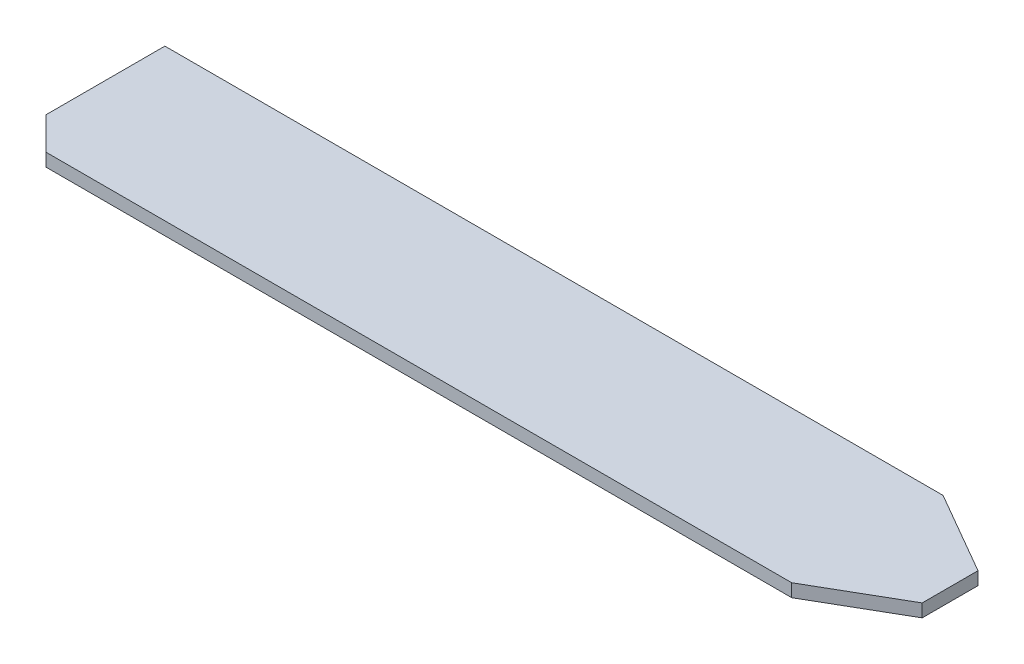
ISO-10303-21;
HEADER;
FILE_DESCRIPTION(('STEP AP214'),'2;1');
FILE_NAME('part.step','',(''),(''),'','','');
FILE_SCHEMA(('AUTOMOTIVE_DESIGN { 1 0 10303 214 1 1 1 1 }'));
ENDSEC;
DATA;
#1=APPLICATION_CONTEXT('core data for automotive mechanical design processes');
#2=APPLICATION_PROTOCOL_DEFINITION('international standard','automotive_design',2000,#1);
#3=PRODUCT_CONTEXT('',#1,'mechanical');
#4=PRODUCT('Part','Part','',(#3));
#5=PRODUCT_RELATED_PRODUCT_CATEGORY('part','',(#4));
#6=PRODUCT_DEFINITION_FORMATION('','',#4);
#7=PRODUCT_DEFINITION_CONTEXT('part definition',#1,'design');
#8=PRODUCT_DEFINITION('design','',#6,#7);
#9=PRODUCT_DEFINITION_SHAPE('','',#8);
#10=(LENGTH_UNIT() NAMED_UNIT(*) SI_UNIT(.MILLI.,.METRE.));
#11=(NAMED_UNIT(*) PLANE_ANGLE_UNIT() SI_UNIT($,.RADIAN.));
#12=(NAMED_UNIT(*) SI_UNIT($,.STERADIAN.) SOLID_ANGLE_UNIT());
#13=UNCERTAINTY_MEASURE_WITH_UNIT(LENGTH_MEASURE(1.E-05),#10,'distance_accuracy_value','');
#14=(GEOMETRIC_REPRESENTATION_CONTEXT(3) GLOBAL_UNCERTAINTY_ASSIGNED_CONTEXT((#13)) GLOBAL_UNIT_ASSIGNED_CONTEXT((#10,
#11,#12)) REPRESENTATION_CONTEXT('',''));
#15=CARTESIAN_POINT('',(0.,0.,0.));
#16=DIRECTION('',(0.,0.,1.));
#17=DIRECTION('',(1.,0.,0.));
#18=AXIS2_PLACEMENT_3D('',#15,#16,#17);
#19=CARTESIAN_POINT('',(360.,6.,0.));
#20=DIRECTION('',(0.500000000000001,0.,-0.866025403784438));
#21=DIRECTION('',(-0.866025403784438,0.,-0.500000000000001));
#22=AXIS2_PLACEMENT_3D('',#19,#20,#21);
#23=PLANE('',#22);
#24=DIRECTION('',(0.866025403784438,0.,0.500000000000001));
#25=VECTOR('',#24,1.);
#26=CARTESIAN_POINT('',(360.,0.,0.));
#27=LINE('',#26,#25);
#28=CARTESIAN_POINT('',(360.,0.,0.));
#29=VERTEX_POINT('',#28);
#30=CARTESIAN_POINT('',(398.261815458281,0.,22.0904694545226));
#31=VERTEX_POINT('',#30);
#32=EDGE_CURVE('E136',#29,#31,#27,.T.);
#33=ORIENTED_EDGE('',*,*,#32,.F.);
#34=DIRECTION('',(0.,-1.,0.));
#35=VECTOR('',#34,1.);
#36=CARTESIAN_POINT('',(360.,6.,0.));
#37=LINE('',#36,#35);
#38=CARTESIAN_POINT('',(360.,6.,0.));
#39=VERTEX_POINT('',#38);
#40=EDGE_CURVE('E11',#39,#29,#37,.T.);
#41=ORIENTED_EDGE('',*,*,#40,.F.);
#42=DIRECTION('',(0.866025403784438,0.,0.500000000000001));
#43=VECTOR('',#42,1.);
#44=CARTESIAN_POINT('',(360.,6.,0.));
#45=LINE('',#44,#43);
#46=CARTESIAN_POINT('',(398.261815458281,6.,22.0904694545226));
#47=VERTEX_POINT('',#46);
#48=EDGE_CURVE('E153',#39,#47,#45,.T.);
#49=ORIENTED_EDGE('',*,*,#48,.T.);
#50=DIRECTION('',(0.,-1.,0.));
#51=VECTOR('',#50,1.);
#52=CARTESIAN_POINT('',(398.261815458281,6.,22.0904694545226));
#53=LINE('',#52,#51);
#54=EDGE_CURVE('E48',#47,#31,#53,.T.);
#55=ORIENTED_EDGE('',*,*,#54,.T.);
#56=EDGE_LOOP('',(#33,#41,#49,#55));
#57=FACE_BOUND('',#56,.T.);
#58=ADVANCED_FACE('F45',(#57),#23,.T.);
#59=CARTESIAN_POINT('',(0.,6.,0.));
#60=DIRECTION('',(0.,0.,-1.));
#61=DIRECTION('',(-1.,0.,0.));
#62=AXIS2_PLACEMENT_3D('',#59,#60,#61);
#63=PLANE('',#62);
#64=DIRECTION('',(1.,0.,0.));
#65=VECTOR('',#64,1.);
#66=CARTESIAN_POINT('',(0.,0.,0.));
#67=LINE('',#66,#65);
#68=CARTESIAN_POINT('',(0.,0.,0.));
#69=VERTEX_POINT('',#68);
#70=EDGE_CURVE('E151',#69,#29,#67,.T.);
#71=ORIENTED_EDGE('',*,*,#70,.F.);
#72=DIRECTION('',(0.,-1.,0.));
#73=VECTOR('',#72,1.);
#74=CARTESIAN_POINT('',(0.,6.,0.));
#75=LINE('',#74,#73);
#76=CARTESIAN_POINT('',(0.,6.,0.));
#77=VERTEX_POINT('',#76);
#78=EDGE_CURVE('E54',#77,#69,#75,.T.);
#79=ORIENTED_EDGE('',*,*,#78,.F.);
#80=DIRECTION('',(1.,0.,0.));
#81=VECTOR('',#80,1.);
#82=CARTESIAN_POINT('',(0.,6.,0.));
#83=LINE('',#82,#81);
#84=EDGE_CURVE('E126',#77,#39,#83,.T.);
#85=ORIENTED_EDGE('',*,*,#84,.T.);
#86=ORIENTED_EDGE('',*,*,#40,.T.);
#87=EDGE_LOOP('',(#71,#79,#85,#86));
#88=FACE_BOUND('',#87,.T.);
#89=ADVANCED_FACE('F164',(#88),#63,.T.);
#90=CARTESIAN_POINT('',(0.,6.,55.));
#91=DIRECTION('',(-1.,0.,0.));
#92=DIRECTION('',(0.,0.,1.));
#93=AXIS2_PLACEMENT_3D('',#90,#91,#92);
#94=PLANE('',#93);
#95=DIRECTION('',(0.,0.,-1.));
#96=VECTOR('',#95,1.);
#97=CARTESIAN_POINT('',(0.,0.,55.));
#98=LINE('',#97,#96);
#99=CARTESIAN_POINT('',(0.,0.,55.));
#100=VERTEX_POINT('',#99);
#101=EDGE_CURVE('E113',#100,#69,#98,.T.);
#102=ORIENTED_EDGE('',*,*,#101,.F.);
#103=DIRECTION('',(0.,-1.,0.));
#104=VECTOR('',#103,1.);
#105=CARTESIAN_POINT('',(0.,6.,55.));
#106=LINE('',#105,#104);
#107=CARTESIAN_POINT('',(0.,6.,55.));
#108=VERTEX_POINT('',#107);
#109=EDGE_CURVE('E108',#108,#100,#106,.T.);
#110=ORIENTED_EDGE('',*,*,#109,.F.);
#111=DIRECTION('',(0.,0.,-1.));
#112=VECTOR('',#111,1.);
#113=CARTESIAN_POINT('',(0.,6.,55.));
#114=LINE('',#113,#112);
#115=EDGE_CURVE('E111',#108,#77,#114,.T.);
#116=ORIENTED_EDGE('',*,*,#115,.T.);
#117=ORIENTED_EDGE('',*,*,#78,.T.);
#118=EDGE_LOOP('',(#102,#110,#116,#117));
#119=FACE_BOUND('',#118,.T.);
#120=ADVANCED_FACE('F110',(#119),#94,.T.);
#121=CARTESIAN_POINT('',(15.,6.,70.));
#122=DIRECTION('',(-0.707106781186548,0.,0.707106781186547));
#123=DIRECTION('',(0.707106781186547,0.,0.707106781186548));
#124=AXIS2_PLACEMENT_3D('',#121,#122,#123);
#125=PLANE('',#124);
#126=DIRECTION('',(-0.707106781186547,0.,-0.707106781186548));
#127=VECTOR('',#126,1.);
#128=CARTESIAN_POINT('',(15.,0.,70.));
#129=LINE('',#128,#127);
#130=CARTESIAN_POINT('',(15.,0.,70.));
#131=VERTEX_POINT('',#130);
#132=EDGE_CURVE('E148',#131,#100,#129,.T.);
#133=ORIENTED_EDGE('',*,*,#132,.F.);
#134=DIRECTION('',(0.,-1.,0.));
#135=VECTOR('',#134,1.);
#136=CARTESIAN_POINT('',(15.,6.,70.));
#137=LINE('',#136,#135);
#138=CARTESIAN_POINT('',(15.,6.,70.));
#139=VERTEX_POINT('',#138);
#140=EDGE_CURVE('E118',#139,#131,#137,.T.);
#141=ORIENTED_EDGE('',*,*,#140,.F.);
#142=DIRECTION('',(-0.707106781186547,0.,-0.707106781186548));
#143=VECTOR('',#142,1.);
#144=CARTESIAN_POINT('',(15.,6.,70.));
#145=LINE('',#144,#143);
#146=EDGE_CURVE('E124',#139,#108,#145,.T.);
#147=ORIENTED_EDGE('',*,*,#146,.T.);
#148=ORIENTED_EDGE('',*,*,#109,.T.);
#149=EDGE_LOOP('',(#133,#141,#147,#148));
#150=FACE_BOUND('',#149,.T.);
#151=ADVANCED_FACE('F128',(#150),#125,.T.);
#152=CARTESIAN_POINT('',(360.,6.,70.));
#153=DIRECTION('',(0.,0.,1.));
#154=DIRECTION('',(1.,0.,0.));
#155=AXIS2_PLACEMENT_3D('',#152,#153,#154);
#156=PLANE('',#155);
#157=DIRECTION('',(-1.,0.,0.));
#158=VECTOR('',#157,1.);
#159=CARTESIAN_POINT('',(360.,0.,70.));
#160=LINE('',#159,#158);
#161=CARTESIAN_POINT('',(360.,0.,70.));
#162=VERTEX_POINT('',#161);
#163=EDGE_CURVE('E145',#162,#131,#160,.T.);
#164=ORIENTED_EDGE('',*,*,#163,.F.);
#165=DIRECTION('',(0.,-1.,0.));
#166=VECTOR('',#165,1.);
#167=CARTESIAN_POINT('',(360.,6.,70.));
#168=LINE('',#167,#166);
#169=CARTESIAN_POINT('',(360.,6.,70.));
#170=VERTEX_POINT('',#169);
#171=EDGE_CURVE('E157',#170,#162,#168,.T.);
#172=ORIENTED_EDGE('',*,*,#171,.F.);
#173=DIRECTION('',(-1.,0.,0.));
#174=VECTOR('',#173,1.);
#175=CARTESIAN_POINT('',(360.,6.,70.));
#176=LINE('',#175,#174);
#177=EDGE_CURVE('E129',#170,#139,#176,.T.);
#178=ORIENTED_EDGE('',*,*,#177,.T.);
#179=ORIENTED_EDGE('',*,*,#140,.T.);
#180=EDGE_LOOP('',(#164,#172,#178,#179));
#181=FACE_BOUND('',#180,.T.);
#182=ADVANCED_FACE('F177',(#181),#156,.T.);
#183=CARTESIAN_POINT('',(360.,6.,70.));
#184=DIRECTION('',(-0.499999999999994,0.,-0.866025403784442));
#185=DIRECTION('',(-0.866025403784442,0.,0.499999999999994));
#186=AXIS2_PLACEMENT_3D('',#183,#184,#185);
#187=PLANE('',#186);
#188=DIRECTION('',(0.866025403784442,0.,-0.499999999999994));
#189=VECTOR('',#188,1.);
#190=CARTESIAN_POINT('',(360.,0.,70.));
#191=LINE('',#190,#189);
#192=CARTESIAN_POINT('',(398.261815458281,0.,47.9095305454778));
#193=VERTEX_POINT('',#192);
#194=EDGE_CURVE('E142',#162,#193,#191,.T.);
#195=ORIENTED_EDGE('',*,*,#194,.T.);
#196=DIRECTION('',(0.,-1.,0.));
#197=VECTOR('',#196,1.);
#198=CARTESIAN_POINT('',(398.261815458281,6.,47.9095305454778));
#199=LINE('',#198,#197);
#200=CARTESIAN_POINT('',(398.261815458281,6.,47.9095305454778));
#201=VERTEX_POINT('',#200);
#202=EDGE_CURVE('E158',#201,#193,#199,.T.);
#203=ORIENTED_EDGE('',*,*,#202,.F.);
#204=DIRECTION('',(0.866025403784442,0.,-0.499999999999994));
#205=VECTOR('',#204,1.);
#206=CARTESIAN_POINT('',(360.,6.,70.));
#207=LINE('',#206,#205);
#208=EDGE_CURVE('E131',#170,#201,#207,.T.);
#209=ORIENTED_EDGE('',*,*,#208,.F.);
#210=ORIENTED_EDGE('',*,*,#171,.T.);
#211=EDGE_LOOP('',(#195,#203,#209,#210));
#212=FACE_BOUND('',#211,.T.);
#213=ADVANCED_FACE('F180',(#212),#187,.F.);
#214=CARTESIAN_POINT('',(398.261815458281,6.,22.0904694545226));
#215=DIRECTION('',(1.,0.,0.));
#216=DIRECTION('',(0.,0.,-1.));
#217=AXIS2_PLACEMENT_3D('',#214,#215,#216);
#218=PLANE('',#217);
#219=DIRECTION('',(0.,0.,1.));
#220=VECTOR('',#219,1.);
#221=CARTESIAN_POINT('',(398.261815458281,0.,22.0904694545226));
#222=LINE('',#221,#220);
#223=EDGE_CURVE('E139',#31,#193,#222,.T.);
#224=ORIENTED_EDGE('',*,*,#223,.F.);
#225=ORIENTED_EDGE('',*,*,#54,.F.);
#226=DIRECTION('',(0.,0.,1.));
#227=VECTOR('',#226,1.);
#228=CARTESIAN_POINT('',(398.261815458281,6.,22.0904694545226));
#229=LINE('',#228,#227);
#230=EDGE_CURVE('E241',#47,#201,#229,.T.);
#231=ORIENTED_EDGE('',*,*,#230,.T.);
#232=ORIENTED_EDGE('',*,*,#202,.T.);
#233=EDGE_LOOP('',(#224,#225,#231,#232));
#234=FACE_BOUND('',#233,.T.);
#235=ADVANCED_FACE('F160',(#234),#218,.T.);
#236=CARTESIAN_POINT('',(0.,6.,0.));
#237=DIRECTION('',(0.,-1.,0.));
#238=DIRECTION('',(0.,0.,-1.));
#239=AXIS2_PLACEMENT_3D('',#236,#237,#238);
#240=PLANE('',#239);
#241=ORIENTED_EDGE('',*,*,#48,.F.);
#242=ORIENTED_EDGE('',*,*,#84,.F.);
#243=ORIENTED_EDGE('',*,*,#115,.F.);
#244=ORIENTED_EDGE('',*,*,#146,.F.);
#245=ORIENTED_EDGE('',*,*,#177,.F.);
#246=ORIENTED_EDGE('',*,*,#208,.T.);
#247=ORIENTED_EDGE('',*,*,#230,.F.);
#248=EDGE_LOOP('',(#241,#242,#243,#244,#245,#246,#247));
#249=FACE_BOUND('',#248,.T.);
#250=ADVANCED_FACE('F122',(#249),#240,.F.);
#251=CARTESIAN_POINT('',(0.,0.,0.));
#252=DIRECTION('',(0.,-1.,0.));
#253=DIRECTION('',(0.,0.,-1.));
#254=AXIS2_PLACEMENT_3D('',#251,#252,#253);
#255=PLANE('',#254);
#256=ORIENTED_EDGE('',*,*,#32,.T.);
#257=ORIENTED_EDGE('',*,*,#223,.T.);
#258=ORIENTED_EDGE('',*,*,#194,.F.);
#259=ORIENTED_EDGE('',*,*,#163,.T.);
#260=ORIENTED_EDGE('',*,*,#132,.T.);
#261=ORIENTED_EDGE('',*,*,#101,.T.);
#262=ORIENTED_EDGE('',*,*,#70,.T.);
#263=EDGE_LOOP('',(#256,#257,#258,#259,#260,#261,#262));
#264=FACE_BOUND('',#263,.T.);
#265=ADVANCED_FACE('F163',(#264),#255,.T.);
#266=CLOSED_SHELL('',(#58,#89,#120,#151,#182,#213,#235,#250,#265));
#267=MANIFOLD_SOLID_BREP('B2',#266);
#268=ADVANCED_BREP_SHAPE_REPRESENTATION('',(#18,#267),#14);
#269=SHAPE_DEFINITION_REPRESENTATION(#9,#268);
ENDSEC;
END-ISO-10303-21;
